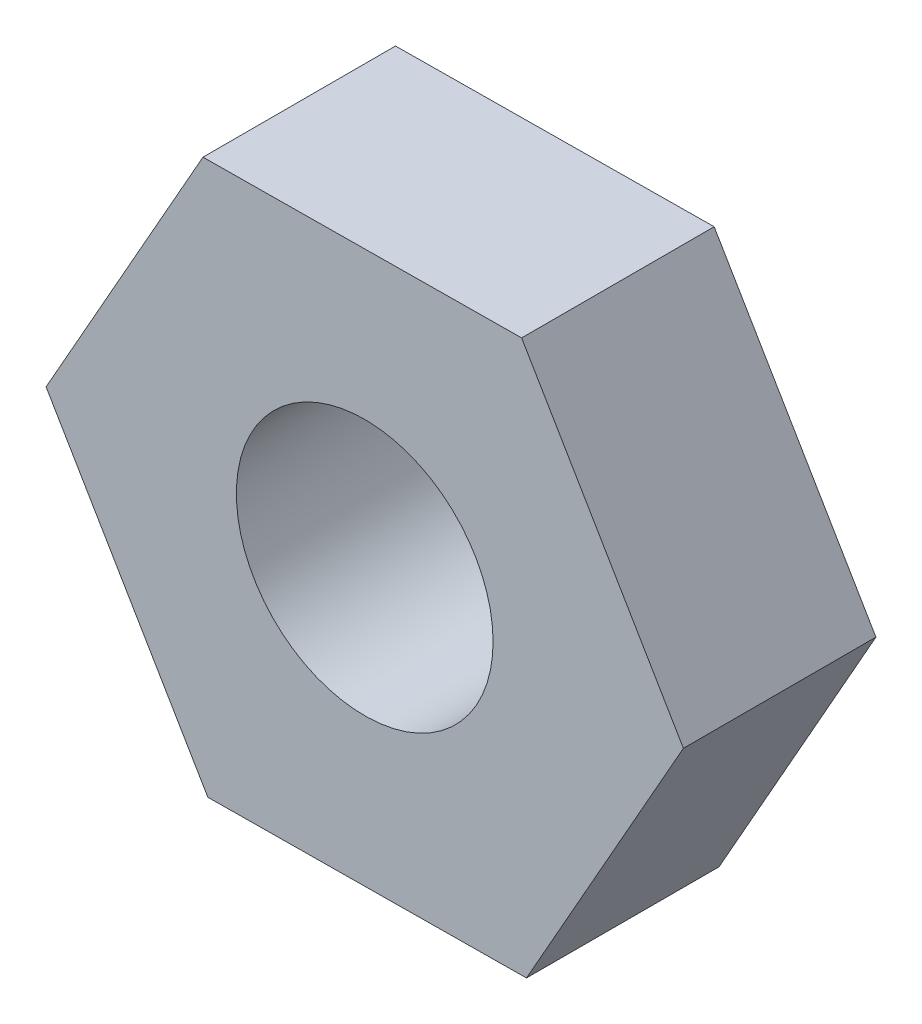
ISO-10303-21;
HEADER;
FILE_DESCRIPTION(('STEP AP214'),'2;1');
FILE_NAME('part.step','',(''),(''),'','','');
FILE_SCHEMA(('AUTOMOTIVE_DESIGN { 1 0 10303 214 1 1 1 1 }'));
ENDSEC;
DATA;
#1=APPLICATION_CONTEXT('core data for automotive mechanical design processes');
#2=APPLICATION_PROTOCOL_DEFINITION('international standard','automotive_design',2000,#1);
#3=PRODUCT_CONTEXT('',#1,'mechanical');
#4=PRODUCT('Part','Part','',(#3));
#5=PRODUCT_RELATED_PRODUCT_CATEGORY('part','',(#4));
#6=PRODUCT_DEFINITION_FORMATION('','',#4);
#7=PRODUCT_DEFINITION_CONTEXT('part definition',#1,'design');
#8=PRODUCT_DEFINITION('design','',#6,#7);
#9=PRODUCT_DEFINITION_SHAPE('','',#8);
#10=(LENGTH_UNIT() NAMED_UNIT(*) SI_UNIT(.MILLI.,.METRE.));
#11=(NAMED_UNIT(*) PLANE_ANGLE_UNIT() SI_UNIT($,.RADIAN.));
#12=(NAMED_UNIT(*) SI_UNIT($,.STERADIAN.) SOLID_ANGLE_UNIT());
#13=UNCERTAINTY_MEASURE_WITH_UNIT(LENGTH_MEASURE(1.E-05),#10,'distance_accuracy_value','');
#14=(GEOMETRIC_REPRESENTATION_CONTEXT(3) GLOBAL_UNCERTAINTY_ASSIGNED_CONTEXT((#13)) GLOBAL_UNIT_ASSIGNED_CONTEXT((#10,
#11,#12)) REPRESENTATION_CONTEXT('',''));
#15=CARTESIAN_POINT('',(0.,0.,0.));
#16=DIRECTION('',(0.,0.,1.));
#17=DIRECTION('',(1.,0.,0.));
#18=AXIS2_PLACEMENT_3D('',#15,#16,#17);
#19=CARTESIAN_POINT('',(0.,0.,1.5));
#20=DIRECTION('',(0.,0.,1.));
#21=DIRECTION('',(1.,0.,0.));
#22=AXIS2_PLACEMENT_3D('',#19,#20,#21);
#23=PLANE('',#22);
#24=DIRECTION('',(0.999961257640527,0.00880245522430762,0.));
#25=VECTOR('',#24,1.);
#26=CARTESIAN_POINT('',(-1.22232970901534,-2.16084321869769,1.5));
#27=LINE('',#26,#25);
#28=CARTESIAN_POINT('',(-1.22232970901534,-2.16084321869769,1.5));
#29=VERTEX_POINT('',#28);
#30=CARTESIAN_POINT('',(1.26018026647986,-2.13899018915657,1.5));
#31=VERTEX_POINT('',#30);
#32=EDGE_CURVE('E132',#29,#31,#27,.T.);
#33=ORIENTED_EDGE('',*,*,#32,.T.);
#34=DIRECTION('',(0.492357478980338,0.870393079529086,0.));
#35=VECTOR('',#34,1.);
#36=CARTESIAN_POINT('',(1.26018026647986,-2.13899018915657,1.5));
#37=LINE('',#36,#35);
#38=CARTESIAN_POINT('',(2.48250997549521,0.0218530295411199,1.5));
#39=VERTEX_POINT('',#38);
#40=EDGE_CURVE('E90',#31,#39,#37,.T.);
#41=ORIENTED_EDGE('',*,*,#40,.T.);
#42=DIRECTION('',(-0.507603778660189,0.861590624304779,0.));
#43=VECTOR('',#42,1.);
#44=CARTESIAN_POINT('',(2.48250997549521,0.0218530295411199,1.5));
#45=LINE('',#44,#43);
#46=CARTESIAN_POINT('',(1.22232970901534,2.16084321869769,1.5));
#47=VERTEX_POINT('',#46);
#48=EDGE_CURVE('E103',#39,#47,#45,.T.);
#49=ORIENTED_EDGE('',*,*,#48,.T.);
#50=DIRECTION('',(-0.999961257640527,-0.00880245522430727,0.));
#51=VECTOR('',#50,1.);
#52=CARTESIAN_POINT('',(1.22232970901534,2.16084321869769,1.5));
#53=LINE('',#52,#51);
#54=CARTESIAN_POINT('',(-1.26018026647986,2.13899018915657,1.5));
#55=VERTEX_POINT('',#54);
#56=EDGE_CURVE('E97',#47,#55,#53,.T.);
#57=ORIENTED_EDGE('',*,*,#56,.T.);
#58=DIRECTION('',(-0.492357478980338,-0.870393079529086,0.));
#59=VECTOR('',#58,1.);
#60=CARTESIAN_POINT('',(-1.26018026647986,2.13899018915657,1.5));
#61=LINE('',#60,#59);
#62=CARTESIAN_POINT('',(-2.48250997549521,-0.0218530295411193,1.5));
#63=VERTEX_POINT('',#62);
#64=EDGE_CURVE('E101',#55,#63,#61,.T.);
#65=ORIENTED_EDGE('',*,*,#64,.T.);
#66=DIRECTION('',(0.507603778660188,-0.861590624304779,0.));
#67=VECTOR('',#66,1.);
#68=CARTESIAN_POINT('',(-2.48250997549521,-0.0218530295411193,1.5));
#69=LINE('',#68,#67);
#70=EDGE_CURVE('E53',#63,#29,#69,.T.);
#71=ORIENTED_EDGE('',*,*,#70,.T.);
#72=EDGE_LOOP('',(#33,#41,#49,#57,#65,#71));
#73=FACE_BOUND('',#72,.T.);
#74=CARTESIAN_POINT('',(0.,0.,1.5));
#75=DIRECTION('',(0.,0.,1.));
#76=DIRECTION('',(1.,0.,0.));
#77=AXIS2_PLACEMENT_3D('',#74,#75,#76);
#78=CIRCLE('',#77,1.);
#79=CARTESIAN_POINT('',(1.,0.,1.5));
#80=VERTEX_POINT('',#79);
#81=EDGE_CURVE('E125',#80,#80,#78,.T.);
#82=ORIENTED_EDGE('',*,*,#81,.F.);
#83=EDGE_LOOP('',(#82));
#84=FACE_BOUND('',#83,.T.);
#85=ADVANCED_FACE('F36',(#73,#84),#23,.T.);
#86=CARTESIAN_POINT('',(0.,0.,0.));
#87=DIRECTION('',(0.,0.,1.));
#88=DIRECTION('',(1.,0.,0.));
#89=AXIS2_PLACEMENT_3D('',#86,#87,#88);
#90=PLANE('',#89);
#91=DIRECTION('',(0.999961257640527,0.00880245522430762,0.));
#92=VECTOR('',#91,1.);
#93=CARTESIAN_POINT('',(-1.22232970901534,-2.16084321869769,0.));
#94=LINE('',#93,#92);
#95=CARTESIAN_POINT('',(-1.22232970901534,-2.16084321869769,0.));
#96=VERTEX_POINT('',#95);
#97=CARTESIAN_POINT('',(1.26018026647986,-2.13899018915657,0.));
#98=VERTEX_POINT('',#97);
#99=EDGE_CURVE('E121',#96,#98,#94,.T.);
#100=ORIENTED_EDGE('',*,*,#99,.F.);
#101=DIRECTION('',(0.507603778660188,-0.861590624304779,0.));
#102=VECTOR('',#101,1.);
#103=CARTESIAN_POINT('',(-2.48250997549521,-0.0218530295411193,0.));
#104=LINE('',#103,#102);
#105=CARTESIAN_POINT('',(-2.48250997549521,-0.0218530295411193,0.));
#106=VERTEX_POINT('',#105);
#107=EDGE_CURVE('E82',#106,#96,#104,.T.);
#108=ORIENTED_EDGE('',*,*,#107,.F.);
#109=DIRECTION('',(-0.492357478980338,-0.870393079529086,0.));
#110=VECTOR('',#109,1.);
#111=CARTESIAN_POINT('',(-1.26018026647986,2.13899018915657,0.));
#112=LINE('',#111,#110);
#113=CARTESIAN_POINT('',(-1.26018026647986,2.13899018915657,0.));
#114=VERTEX_POINT('',#113);
#115=EDGE_CURVE('E76',#114,#106,#112,.T.);
#116=ORIENTED_EDGE('',*,*,#115,.F.);
#117=DIRECTION('',(-0.999961257640527,-0.00880245522430727,0.));
#118=VECTOR('',#117,1.);
#119=CARTESIAN_POINT('',(1.22232970901534,2.16084321869769,0.));
#120=LINE('',#119,#118);
#121=CARTESIAN_POINT('',(1.22232970901534,2.16084321869769,0.));
#122=VERTEX_POINT('',#121);
#123=EDGE_CURVE('E111',#122,#114,#120,.T.);
#124=ORIENTED_EDGE('',*,*,#123,.F.);
#125=DIRECTION('',(-0.507603778660189,0.861590624304779,0.));
#126=VECTOR('',#125,1.);
#127=CARTESIAN_POINT('',(2.48250997549521,0.0218530295411199,0.));
#128=LINE('',#127,#126);
#129=CARTESIAN_POINT('',(2.48250997549521,0.0218530295411199,0.));
#130=VERTEX_POINT('',#129);
#131=EDGE_CURVE('E127',#130,#122,#128,.T.);
#132=ORIENTED_EDGE('',*,*,#131,.F.);
#133=DIRECTION('',(0.492357478980338,0.870393079529086,0.));
#134=VECTOR('',#133,1.);
#135=CARTESIAN_POINT('',(1.26018026647986,-2.13899018915657,0.));
#136=LINE('',#135,#134);
#137=EDGE_CURVE('E124',#98,#130,#136,.T.);
#138=ORIENTED_EDGE('',*,*,#137,.F.);
#139=EDGE_LOOP('',(#100,#108,#116,#124,#132,#138));
#140=FACE_BOUND('',#139,.T.);
#141=CARTESIAN_POINT('',(0.,0.,0.));
#142=DIRECTION('',(0.,0.,1.));
#143=DIRECTION('',(1.,0.,0.));
#144=AXIS2_PLACEMENT_3D('',#141,#142,#143);
#145=CIRCLE('',#144,1.);
#146=CARTESIAN_POINT('',(1.,0.,0.));
#147=VERTEX_POINT('',#146);
#148=EDGE_CURVE('E225',#147,#147,#145,.T.);
#149=ORIENTED_EDGE('',*,*,#148,.T.);
#150=EDGE_LOOP('',(#149));
#151=FACE_BOUND('',#150,.T.);
#152=ADVANCED_FACE('F141',(#140,#151),#90,.F.);
#153=CARTESIAN_POINT('',(-1.22232970901534,-2.16084321869769,1.5));
#154=DIRECTION('',(-0.00880245522430762,0.999961257640527,0.));
#155=DIRECTION('',(-0.999961257640527,-0.00880245522430762,0.));
#156=AXIS2_PLACEMENT_3D('',#153,#154,#155);
#157=PLANE('',#156);
#158=ORIENTED_EDGE('',*,*,#99,.T.);
#159=DIRECTION('',(0.,0.,-1.));
#160=VECTOR('',#159,1.);
#161=CARTESIAN_POINT('',(1.26018026647986,-2.13899018915657,1.5));
#162=LINE('',#161,#160);
#163=EDGE_CURVE('E11',#31,#98,#162,.T.);
#164=ORIENTED_EDGE('',*,*,#163,.F.);
#165=ORIENTED_EDGE('',*,*,#32,.F.);
#166=DIRECTION('',(0.,0.,-1.));
#167=VECTOR('',#166,1.);
#168=CARTESIAN_POINT('',(-1.22232970901534,-2.16084321869769,1.5));
#169=LINE('',#168,#167);
#170=EDGE_CURVE('E117',#29,#96,#169,.T.);
#171=ORIENTED_EDGE('',*,*,#170,.T.);
#172=EDGE_LOOP('',(#158,#164,#165,#171));
#173=FACE_BOUND('',#172,.T.);
#174=ADVANCED_FACE('F38',(#173),#157,.F.);
#175=CARTESIAN_POINT('',(1.26018026647986,-2.13899018915657,1.5));
#176=DIRECTION('',(-0.870393079529086,0.492357478980338,0.));
#177=DIRECTION('',(-0.492357478980338,-0.870393079529086,0.));
#178=AXIS2_PLACEMENT_3D('',#175,#176,#177);
#179=PLANE('',#178);
#180=ORIENTED_EDGE('',*,*,#137,.T.);
#181=DIRECTION('',(0.,0.,-1.));
#182=VECTOR('',#181,1.);
#183=CARTESIAN_POINT('',(2.48250997549521,0.0218530295411199,1.5));
#184=LINE('',#183,#182);
#185=EDGE_CURVE('E45',#39,#130,#184,.T.);
#186=ORIENTED_EDGE('',*,*,#185,.F.);
#187=ORIENTED_EDGE('',*,*,#40,.F.);
#188=ORIENTED_EDGE('',*,*,#163,.T.);
#189=EDGE_LOOP('',(#180,#186,#187,#188));
#190=FACE_BOUND('',#189,.T.);
#191=ADVANCED_FACE('F166',(#190),#179,.F.);
#192=CARTESIAN_POINT('',(2.48250997549521,0.0218530295411199,1.5));
#193=DIRECTION('',(-0.861590624304778,-0.507603778660189,0.));
#194=DIRECTION('',(0.507603778660189,-0.861590624304779,0.));
#195=AXIS2_PLACEMENT_3D('',#192,#193,#194);
#196=PLANE('',#195);
#197=ORIENTED_EDGE('',*,*,#131,.T.);
#198=DIRECTION('',(0.,0.,-1.));
#199=VECTOR('',#198,1.);
#200=CARTESIAN_POINT('',(1.22232970901534,2.16084321869769,1.5));
#201=LINE('',#200,#199);
#202=EDGE_CURVE('E112',#47,#122,#201,.T.);
#203=ORIENTED_EDGE('',*,*,#202,.F.);
#204=ORIENTED_EDGE('',*,*,#48,.F.);
#205=ORIENTED_EDGE('',*,*,#185,.T.);
#206=EDGE_LOOP('',(#197,#203,#204,#205));
#207=FACE_BOUND('',#206,.T.);
#208=ADVANCED_FACE('F138',(#207),#196,.F.);
#209=CARTESIAN_POINT('',(1.22232970901534,2.16084321869769,1.5));
#210=DIRECTION('',(0.00880245522430727,-0.999961257640527,0.));
#211=DIRECTION('',(0.999961257640527,0.00880245522430727,0.));
#212=AXIS2_PLACEMENT_3D('',#209,#210,#211);
#213=PLANE('',#212);
#214=ORIENTED_EDGE('',*,*,#123,.T.);
#215=DIRECTION('',(0.,0.,-1.));
#216=VECTOR('',#215,1.);
#217=CARTESIAN_POINT('',(-1.26018026647986,2.13899018915657,1.5));
#218=LINE('',#217,#216);
#219=EDGE_CURVE('E108',#55,#114,#218,.T.);
#220=ORIENTED_EDGE('',*,*,#219,.F.);
#221=ORIENTED_EDGE('',*,*,#56,.F.);
#222=ORIENTED_EDGE('',*,*,#202,.T.);
#223=EDGE_LOOP('',(#214,#220,#221,#222));
#224=FACE_BOUND('',#223,.T.);
#225=ADVANCED_FACE('F109',(#224),#213,.F.);
#226=CARTESIAN_POINT('',(-1.26018026647986,2.13899018915657,1.5));
#227=DIRECTION('',(0.870393079529086,-0.492357478980338,0.));
#228=DIRECTION('',(0.492357478980338,0.870393079529086,0.));
#229=AXIS2_PLACEMENT_3D('',#226,#227,#228);
#230=PLANE('',#229);
#231=ORIENTED_EDGE('',*,*,#115,.T.);
#232=DIRECTION('',(0.,0.,-1.));
#233=VECTOR('',#232,1.);
#234=CARTESIAN_POINT('',(-2.48250997549521,-0.0218530295411193,1.5));
#235=LINE('',#234,#233);
#236=EDGE_CURVE('E113',#63,#106,#235,.T.);
#237=ORIENTED_EDGE('',*,*,#236,.F.);
#238=ORIENTED_EDGE('',*,*,#64,.F.);
#239=ORIENTED_EDGE('',*,*,#219,.T.);
#240=EDGE_LOOP('',(#231,#237,#238,#239));
#241=FACE_BOUND('',#240,.T.);
#242=ADVANCED_FACE('F115',(#241),#230,.F.);
#243=CARTESIAN_POINT('',(-2.48250997549521,-0.0218530295411193,1.5));
#244=DIRECTION('',(0.861590624304779,0.507603778660188,0.));
#245=DIRECTION('',(-0.507603778660188,0.861590624304779,0.));
#246=AXIS2_PLACEMENT_3D('',#243,#244,#245);
#247=PLANE('',#246);
#248=ORIENTED_EDGE('',*,*,#107,.T.);
#249=ORIENTED_EDGE('',*,*,#170,.F.);
#250=ORIENTED_EDGE('',*,*,#70,.F.);
#251=ORIENTED_EDGE('',*,*,#236,.T.);
#252=EDGE_LOOP('',(#248,#249,#250,#251));
#253=FACE_BOUND('',#252,.T.);
#254=ADVANCED_FACE('F146',(#253),#247,.F.);
#255=CARTESIAN_POINT('',(0.,0.,1.5));
#256=DIRECTION('',(0.,0.,-1.));
#257=DIRECTION('',(-1.,0.,0.));
#258=AXIS2_PLACEMENT_3D('',#255,#256,#257);
#259=CYLINDRICAL_SURFACE('',#258,1.);
#260=ORIENTED_EDGE('',*,*,#81,.T.);
#261=EDGE_LOOP('',(#260));
#262=FACE_BOUND('',#261,.T.);
#263=ORIENTED_EDGE('',*,*,#148,.F.);
#264=EDGE_LOOP('',(#263));
#265=FACE_BOUND('',#264,.T.);
#266=ADVANCED_FACE('F148',(#262,#265),#259,.F.);
#267=CLOSED_SHELL('',(#85,#152,#174,#191,#208,#225,#242,#254,#266));
#268=MANIFOLD_SOLID_BREP('B2',#267);
#269=ADVANCED_BREP_SHAPE_REPRESENTATION('',(#18,#268),#14);
#270=SHAPE_DEFINITION_REPRESENTATION(#9,#269);
ENDSEC;
END-ISO-10303-21;
